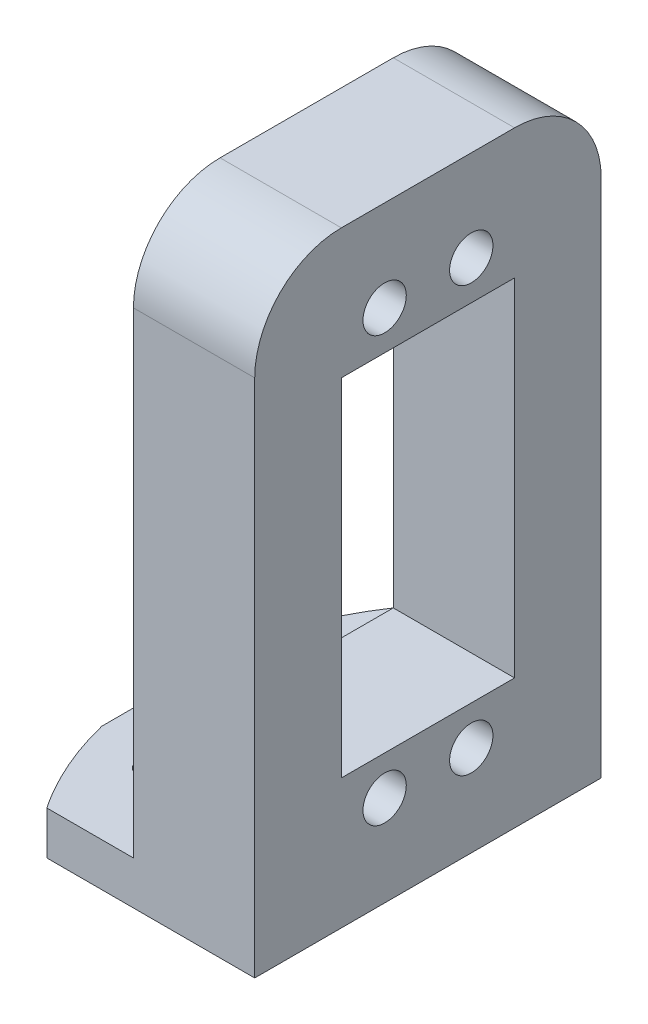
ISO-10303-21;
HEADER;
FILE_DESCRIPTION(('STEP AP214'),'2;1');
FILE_NAME('part.step','',(''),(''),'','','');
FILE_SCHEMA(('AUTOMOTIVE_DESIGN { 1 0 10303 214 1 1 1 1 }'));
ENDSEC;
DATA;
#1=APPLICATION_CONTEXT('core data for automotive mechanical design processes');
#2=APPLICATION_PROTOCOL_DEFINITION('international standard','automotive_design',2000,#1);
#3=PRODUCT_CONTEXT('',#1,'mechanical');
#4=PRODUCT('Part','Part','',(#3));
#5=PRODUCT_RELATED_PRODUCT_CATEGORY('part','',(#4));
#6=PRODUCT_DEFINITION_FORMATION('','',#4);
#7=PRODUCT_DEFINITION_CONTEXT('part definition',#1,'design');
#8=PRODUCT_DEFINITION('design','',#6,#7);
#9=PRODUCT_DEFINITION_SHAPE('','',#8);
#10=(LENGTH_UNIT() NAMED_UNIT(*) SI_UNIT(.MILLI.,.METRE.));
#11=(NAMED_UNIT(*) PLANE_ANGLE_UNIT() SI_UNIT($,.RADIAN.));
#12=(NAMED_UNIT(*) SI_UNIT($,.STERADIAN.) SOLID_ANGLE_UNIT());
#13=UNCERTAINTY_MEASURE_WITH_UNIT(LENGTH_MEASURE(1.E-05),#10,'distance_accuracy_value','');
#14=(GEOMETRIC_REPRESENTATION_CONTEXT(3) GLOBAL_UNCERTAINTY_ASSIGNED_CONTEXT((#13)) GLOBAL_UNIT_ASSIGNED_CONTEXT((#10,
#11,#12)) REPRESENTATION_CONTEXT('',''));
#15=CARTESIAN_POINT('',(0.,0.,0.));
#16=DIRECTION('',(0.,0.,1.));
#17=DIRECTION('',(1.,0.,0.));
#18=AXIS2_PLACEMENT_3D('',#15,#16,#17);
#19=CARTESIAN_POINT('',(0.,-24.5,5.));
#20=DIRECTION('',(1.,0.,0.));
#21=DIRECTION('',(0.,0.,-1.));
#22=AXIS2_PLACEMENT_3D('',#19,#20,#21);
#23=CYLINDRICAL_SURFACE('',#22,1.5);
#24=CARTESIAN_POINT('',(-5.,-24.5,5.));
#25=DIRECTION('',(-1.,0.,0.));
#26=DIRECTION('',(0.,0.,1.));
#27=AXIS2_PLACEMENT_3D('',#24,#25,#26);
#28=CIRCLE('',#27,1.5);
#29=CARTESIAN_POINT('',(-5.,-24.5,6.50000000000001));
#30=VERTEX_POINT('',#29);
#31=EDGE_CURVE('E179',#30,#30,#28,.T.);
#32=ORIENTED_EDGE('',*,*,#31,.T.);
#33=EDGE_LOOP('',(#32));
#34=FACE_BOUND('',#33,.T.);
#35=CARTESIAN_POINT('',(4.,-24.5,5.));
#36=DIRECTION('',(1.,0.,0.));
#37=DIRECTION('',(0.,0.,-1.));
#38=AXIS2_PLACEMENT_3D('',#35,#36,#37);
#39=CIRCLE('',#38,1.5);
#40=CARTESIAN_POINT('',(4.,-24.5,3.5));
#41=VERTEX_POINT('',#40);
#42=EDGE_CURVE('E44',#41,#41,#39,.F.);
#43=ORIENTED_EDGE('',*,*,#42,.F.);
#44=EDGE_LOOP('',(#43));
#45=FACE_BOUND('',#44,.T.);
#46=ADVANCED_FACE('F40',(#34,#45),#23,.F.);
#47=CARTESIAN_POINT('',(0.,24.5,-5.));
#48=DIRECTION('',(1.,0.,0.));
#49=DIRECTION('',(0.,0.,-1.));
#50=AXIS2_PLACEMENT_3D('',#47,#48,#49);
#51=CYLINDRICAL_SURFACE('',#50,1.5);
#52=CARTESIAN_POINT('',(-5.,24.5,-5.));
#53=DIRECTION('',(-1.,0.,0.));
#54=DIRECTION('',(0.,0.,1.));
#55=AXIS2_PLACEMENT_3D('',#52,#53,#54);
#56=CIRCLE('',#55,1.5);
#57=CARTESIAN_POINT('',(-5.,24.5,-3.49999999999999));
#58=VERTEX_POINT('',#57);
#59=EDGE_CURVE('E191',#58,#58,#56,.T.);
#60=ORIENTED_EDGE('',*,*,#59,.T.);
#61=EDGE_LOOP('',(#60));
#62=FACE_BOUND('',#61,.T.);
#63=CARTESIAN_POINT('',(4.,24.5,-5.));
#64=DIRECTION('',(1.,0.,0.));
#65=DIRECTION('',(0.,0.,-1.));
#66=AXIS2_PLACEMENT_3D('',#63,#64,#65);
#67=CIRCLE('',#66,1.5);
#68=CARTESIAN_POINT('',(4.,24.5,-6.5));
#69=VERTEX_POINT('',#68);
#70=EDGE_CURVE('E364',#69,#69,#67,.F.);
#71=ORIENTED_EDGE('',*,*,#70,.F.);
#72=EDGE_LOOP('',(#71));
#73=FACE_BOUND('',#72,.T.);
#74=ADVANCED_FACE('F376',(#62,#73),#51,.F.);
#75=CARTESIAN_POINT('',(0.,24.5,5.));
#76=DIRECTION('',(1.,0.,0.));
#77=DIRECTION('',(0.,0.,-1.));
#78=AXIS2_PLACEMENT_3D('',#75,#76,#77);
#79=CYLINDRICAL_SURFACE('',#78,1.5);
#80=CARTESIAN_POINT('',(-5.,24.5,5.));
#81=DIRECTION('',(-1.,0.,0.));
#82=DIRECTION('',(0.,0.,1.));
#83=AXIS2_PLACEMENT_3D('',#80,#81,#82);
#84=CIRCLE('',#83,1.5);
#85=CARTESIAN_POINT('',(-5.,24.5,6.50000000000001));
#86=VERTEX_POINT('',#85);
#87=EDGE_CURVE('E187',#86,#86,#84,.T.);
#88=ORIENTED_EDGE('',*,*,#87,.T.);
#89=EDGE_LOOP('',(#88));
#90=FACE_BOUND('',#89,.T.);
#91=CARTESIAN_POINT('',(4.,24.5,5.));
#92=DIRECTION('',(1.,0.,0.));
#93=DIRECTION('',(0.,0.,-1.));
#94=AXIS2_PLACEMENT_3D('',#91,#92,#93);
#95=CIRCLE('',#94,1.5);
#96=CARTESIAN_POINT('',(4.,24.5,3.5));
#97=VERTEX_POINT('',#96);
#98=EDGE_CURVE('E360',#97,#97,#95,.F.);
#99=ORIENTED_EDGE('',*,*,#98,.F.);
#100=EDGE_LOOP('',(#99));
#101=FACE_BOUND('',#100,.T.);
#102=ADVANCED_FACE('F383',(#90,#101),#79,.F.);
#103=CARTESIAN_POINT('',(0.,-24.5,-5.));
#104=DIRECTION('',(1.,0.,0.));
#105=DIRECTION('',(0.,0.,-1.));
#106=AXIS2_PLACEMENT_3D('',#103,#104,#105);
#107=CYLINDRICAL_SURFACE('',#106,1.5);
#108=CARTESIAN_POINT('',(-5.,-24.5,-5.));
#109=DIRECTION('',(-1.,0.,0.));
#110=DIRECTION('',(0.,0.,1.));
#111=AXIS2_PLACEMENT_3D('',#108,#109,#110);
#112=CIRCLE('',#111,1.5);
#113=CARTESIAN_POINT('',(-5.,-24.5,-3.49999999999999));
#114=VERTEX_POINT('',#113);
#115=EDGE_CURVE('E183',#114,#114,#112,.T.);
#116=ORIENTED_EDGE('',*,*,#115,.T.);
#117=EDGE_LOOP('',(#116));
#118=FACE_BOUND('',#117,.T.);
#119=CARTESIAN_POINT('',(4.,-24.5,-5.));
#120=DIRECTION('',(1.,0.,0.));
#121=DIRECTION('',(0.,0.,-1.));
#122=AXIS2_PLACEMENT_3D('',#119,#120,#121);
#123=CIRCLE('',#122,1.5);
#124=CARTESIAN_POINT('',(4.,-24.5,-6.5));
#125=VERTEX_POINT('',#124);
#126=EDGE_CURVE('E356',#125,#125,#123,.F.);
#127=ORIENTED_EDGE('',*,*,#126,.F.);
#128=EDGE_LOOP('',(#127));
#129=FACE_BOUND('',#128,.T.);
#130=ADVANCED_FACE('F467',(#118,#129),#107,.F.);
#131=CARTESIAN_POINT('',(9.,35.,-20.));
#132=DIRECTION('',(0.,0.,1.));
#133=DIRECTION('',(0.,-1.,0.));
#134=AXIS2_PLACEMENT_3D('',#131,#132,#133);
#135=PLANE('',#134);
#136=DIRECTION('',(0.,1.,0.));
#137=VECTOR('',#136,1.);
#138=CARTESIAN_POINT('',(-15.,-35.,-20.));
#139=LINE('',#138,#137);
#140=CARTESIAN_POINT('',(-15.,-35.,-20.));
#141=VERTEX_POINT('',#140);
#142=CARTESIAN_POINT('',(-15.,-30.,-20.));
#143=VERTEX_POINT('',#142);
#144=EDGE_CURVE('E219',#141,#143,#139,.T.);
#145=ORIENTED_EDGE('',*,*,#144,.T.);
#146=DIRECTION('',(1.,0.,0.));
#147=VECTOR('',#146,1.);
#148=CARTESIAN_POINT('',(-15.,-30.,-20.));
#149=LINE('',#148,#147);
#150=CARTESIAN_POINT('',(-5.,-30.,-20.));
#151=VERTEX_POINT('',#150);
#152=EDGE_CURVE('E300',#143,#151,#149,.T.);
#153=ORIENTED_EDGE('',*,*,#152,.T.);
#154=DIRECTION('',(0.,-1.,0.));
#155=VECTOR('',#154,1.);
#156=CARTESIAN_POINT('',(-5.,24.9999999999999,-20.));
#157=LINE('',#156,#155);
#158=CARTESIAN_POINT('',(-5.,24.9999999999999,-20.0000000000001));
#159=VERTEX_POINT('',#158);
#160=EDGE_CURVE('E195',#159,#151,#157,.T.);
#161=ORIENTED_EDGE('',*,*,#160,.F.);
#162=DIRECTION('',(1.,0.,0.));
#163=VECTOR('',#162,1.);
#164=CARTESIAN_POINT('',(-15.,25.,-20.));
#165=LINE('',#164,#163);
#166=CARTESIAN_POINT('',(9.,25.,-20.));
#167=VERTEX_POINT('',#166);
#168=EDGE_CURVE('E306',#159,#167,#165,.T.);
#169=ORIENTED_EDGE('',*,*,#168,.T.);
#170=DIRECTION('',(0.,1.,0.));
#171=VECTOR('',#170,1.);
#172=CARTESIAN_POINT('',(9.,35.,-20.));
#173=LINE('',#172,#171);
#174=CARTESIAN_POINT('',(9.,-35.,-20.));
#175=VERTEX_POINT('',#174);
#176=EDGE_CURVE('E334',#175,#167,#173,.T.);
#177=ORIENTED_EDGE('',*,*,#176,.F.);
#178=DIRECTION('',(-1.,0.,0.));
#179=VECTOR('',#178,1.);
#180=CARTESIAN_POINT('',(9.,-35.,-20.));
#181=LINE('',#180,#179);
#182=EDGE_CURVE('E50',#175,#141,#181,.T.);
#183=ORIENTED_EDGE('',*,*,#182,.T.);
#184=EDGE_LOOP('',(#145,#153,#161,#169,#177,#183));
#185=FACE_BOUND('',#184,.T.);
#186=ADVANCED_FACE('F42',(#185),#135,.F.);
#187=CARTESIAN_POINT('',(9.,35.,20.));
#188=DIRECTION('',(0.,0.,-1.));
#189=DIRECTION('',(0.,1.,0.));
#190=AXIS2_PLACEMENT_3D('',#187,#188,#189);
#191=PLANE('',#190);
#192=DIRECTION('',(0.,1.,0.));
#193=VECTOR('',#192,1.);
#194=CARTESIAN_POINT('',(-15.,-35.,20.));
#195=LINE('',#194,#193);
#196=CARTESIAN_POINT('',(-15.,-35.,20.));
#197=VERTEX_POINT('',#196);
#198=CARTESIAN_POINT('',(-15.,-30.,20.));
#199=VERTEX_POINT('',#198);
#200=EDGE_CURVE('E254',#197,#199,#195,.T.);
#201=ORIENTED_EDGE('',*,*,#200,.F.);
#202=DIRECTION('',(-1.,0.,0.));
#203=VECTOR('',#202,1.);
#204=CARTESIAN_POINT('',(9.,-35.,20.));
#205=LINE('',#204,#203);
#206=CARTESIAN_POINT('',(9.,-35.,20.));
#207=VERTEX_POINT('',#206);
#208=EDGE_CURVE('E11',#207,#197,#205,.T.);
#209=ORIENTED_EDGE('',*,*,#208,.F.);
#210=DIRECTION('',(0.,-1.,0.));
#211=VECTOR('',#210,1.);
#212=CARTESIAN_POINT('',(9.,35.,20.));
#213=LINE('',#212,#211);
#214=CARTESIAN_POINT('',(9.,25.,20.));
#215=VERTEX_POINT('',#214);
#216=EDGE_CURVE('E347',#215,#207,#213,.T.);
#217=ORIENTED_EDGE('',*,*,#216,.F.);
#218=DIRECTION('',(1.,0.,0.));
#219=VECTOR('',#218,1.);
#220=CARTESIAN_POINT('',(-15.,25.,20.));
#221=LINE('',#220,#219);
#222=CARTESIAN_POINT('',(-5.,25.,20.));
#223=VERTEX_POINT('',#222);
#224=EDGE_CURVE('E297',#223,#215,#221,.T.);
#225=ORIENTED_EDGE('',*,*,#224,.F.);
#226=DIRECTION('',(0.,1.,0.));
#227=VECTOR('',#226,1.);
#228=CARTESIAN_POINT('',(-5.,-27.,20.));
#229=LINE('',#228,#227);
#230=CARTESIAN_POINT('',(-5.,-30.,20.));
#231=VERTEX_POINT('',#230);
#232=EDGE_CURVE('E198',#231,#223,#229,.T.);
#233=ORIENTED_EDGE('',*,*,#232,.F.);
#234=DIRECTION('',(1.,0.,0.));
#235=VECTOR('',#234,1.);
#236=CARTESIAN_POINT('',(-15.,-30.,20.));
#237=LINE('',#236,#235);
#238=EDGE_CURVE('E315',#199,#231,#237,.T.);
#239=ORIENTED_EDGE('',*,*,#238,.F.);
#240=EDGE_LOOP('',(#201,#209,#217,#225,#233,#239));
#241=FACE_BOUND('',#240,.T.);
#242=ADVANCED_FACE('F411',(#241),#191,.F.);
#243=CARTESIAN_POINT('',(9.,-35.,20.));
#244=DIRECTION('',(0.,1.,0.));
#245=DIRECTION('',(0.,0.,1.));
#246=AXIS2_PLACEMENT_3D('',#243,#244,#245);
#247=PLANE('',#246);
#248=CARTESIAN_POINT('',(-13.,-35.,-10.));
#249=DIRECTION('',(0.,1.,0.));
#250=DIRECTION('',(0.,0.,1.));
#251=AXIS2_PLACEMENT_3D('',#248,#249,#250);
#252=CIRCLE('',#251,1.5);
#253=CARTESIAN_POINT('',(-13.,-35.,-8.50000000000001));
#254=VERTEX_POINT('',#253);
#255=EDGE_CURVE('E262',#254,#254,#252,.T.);
#256=ORIENTED_EDGE('',*,*,#255,.T.);
#257=EDGE_LOOP('',(#256));
#258=FACE_BOUND('',#257,.T.);
#259=CARTESIAN_POINT('',(-13.,-35.,9.99999999999999));
#260=DIRECTION('',(0.,1.,0.));
#261=DIRECTION('',(0.,0.,1.));
#262=AXIS2_PLACEMENT_3D('',#259,#260,#261);
#263=CIRCLE('',#262,1.5);
#264=CARTESIAN_POINT('',(-13.,-35.,11.5));
#265=VERTEX_POINT('',#264);
#266=EDGE_CURVE('E271',#265,#265,#263,.T.);
#267=ORIENTED_EDGE('',*,*,#266,.T.);
#268=EDGE_LOOP('',(#267));
#269=FACE_BOUND('',#268,.T.);
#270=CARTESIAN_POINT('',(-15.,-35.,-20.));
#271=CARTESIAN_POINT('',(-23.0603486349909,-35.,-8.00303116626541));
#272=CARTESIAN_POINT('',(-23.0603486349909,-35.,7.99696883373459));
#273=CARTESIAN_POINT('',(-15.,-35.,20.));
#274=B_SPLINE_CURVE_WITH_KNOTS('',3,(#270,#271,#272,#273),.UNSPECIFIED.,.F.,.F.,(4,4),(0.,1.),.UNSPECIFIED.);
#275=CARTESIAN_POINT('',(-20.,-35.,-8.66219364434589));
#276=VERTEX_POINT('',#275);
#277=EDGE_CURVE('E66',#141,#276,#274,.T.);
#278=ORIENTED_EDGE('',*,*,#277,.F.);
#279=ORIENTED_EDGE('',*,*,#182,.F.);
#280=DIRECTION('',(0.,0.,-1.));
#281=VECTOR('',#280,1.);
#282=CARTESIAN_POINT('',(9.,-35.,20.));
#283=LINE('',#282,#281);
#284=EDGE_CURVE('E350',#207,#175,#283,.T.);
#285=ORIENTED_EDGE('',*,*,#284,.F.);
#286=ORIENTED_EDGE('',*,*,#208,.T.);
#287=CARTESIAN_POINT('',(-15.,-35.,-20.));
#288=CARTESIAN_POINT('',(-23.0603486349909,-35.,-8.00303116626541));
#289=CARTESIAN_POINT('',(-23.0603486349909,-35.,7.99696883373459));
#290=CARTESIAN_POINT('',(-15.,-35.,20.));
#291=B_SPLINE_CURVE_WITH_KNOTS('',3,(#287,#288,#289,#290),.UNSPECIFIED.,.F.,.F.,(4,4),(0.,1.),.UNSPECIFIED.);
#292=CARTESIAN_POINT('',(-20.,-35.,8.65843305481963));
#293=VERTEX_POINT('',#292);
#294=EDGE_CURVE('E239',#293,#197,#291,.T.);
#295=ORIENTED_EDGE('',*,*,#294,.F.);
#296=DIRECTION('',(0.,0.,1.));
#297=VECTOR('',#296,1.);
#298=CARTESIAN_POINT('',(-20.,-35.,-20.));
#299=LINE('',#298,#297);
#300=EDGE_CURVE('E266',#276,#293,#299,.T.);
#301=ORIENTED_EDGE('',*,*,#300,.F.);
#302=EDGE_LOOP('',(#278,#279,#285,#286,#295,#301));
#303=FACE_BOUND('',#302,.T.);
#304=ADVANCED_FACE('F407',(#258,#269,#303),#247,.F.);
#305=CARTESIAN_POINT('',(-15.,-30.,-20.));
#306=DIRECTION('',(0.,-1.,0.));
#307=DIRECTION('',(0.,0.,-1.));
#308=AXIS2_PLACEMENT_3D('',#305,#306,#307);
#309=PLANE('',#308);
#310=CARTESIAN_POINT('',(-13.,-30.,-10.));
#311=DIRECTION('',(0.,1.,0.));
#312=DIRECTION('',(0.,0.,1.));
#313=AXIS2_PLACEMENT_3D('',#310,#311,#312);
#314=CIRCLE('',#313,1.5);
#315=CARTESIAN_POINT('',(-13.,-30.,-8.50000000000001));
#316=VERTEX_POINT('',#315);
#317=EDGE_CURVE('E267',#316,#316,#314,.T.);
#318=ORIENTED_EDGE('',*,*,#317,.F.);
#319=EDGE_LOOP('',(#318));
#320=FACE_BOUND('',#319,.T.);
#321=CARTESIAN_POINT('',(-13.,-30.,9.99999999999999));
#322=DIRECTION('',(0.,1.,0.));
#323=DIRECTION('',(0.,0.,1.));
#324=AXIS2_PLACEMENT_3D('',#321,#322,#323);
#325=CIRCLE('',#324,1.5);
#326=CARTESIAN_POINT('',(-13.,-30.,11.5));
#327=VERTEX_POINT('',#326);
#328=EDGE_CURVE('E275',#327,#327,#325,.T.);
#329=ORIENTED_EDGE('',*,*,#328,.F.);
#330=EDGE_LOOP('',(#329));
#331=FACE_BOUND('',#330,.T.);
#332=CARTESIAN_POINT('',(-15.,-30.,-20.));
#333=CARTESIAN_POINT('',(-23.0603486349909,-30.,-8.00303116626541));
#334=CARTESIAN_POINT('',(-23.0603486349909,-30.,7.99696883373459));
#335=CARTESIAN_POINT('',(-15.,-30.,20.));
#336=B_SPLINE_CURVE_WITH_KNOTS('',3,(#332,#333,#334,#335),.UNSPECIFIED.,.F.,.F.,(4,4),(0.,1.),.UNSPECIFIED.);
#337=CARTESIAN_POINT('',(-20.,-30.,-8.66219364434589));
#338=VERTEX_POINT('',#337);
#339=EDGE_CURVE('E220',#143,#338,#336,.T.);
#340=ORIENTED_EDGE('',*,*,#339,.T.);
#341=DIRECTION('',(0.,0.,-1.));
#342=VECTOR('',#341,1.);
#343=CARTESIAN_POINT('',(-20.,-30.,-20.));
#344=LINE('',#343,#342);
#345=CARTESIAN_POINT('',(-20.,-30.,8.65843305481963));
#346=VERTEX_POINT('',#345);
#347=EDGE_CURVE('E283',#346,#338,#344,.T.);
#348=ORIENTED_EDGE('',*,*,#347,.F.);
#349=CARTESIAN_POINT('',(-15.,-30.,-20.));
#350=CARTESIAN_POINT('',(-23.0603486349909,-30.,-8.00303116626541));
#351=CARTESIAN_POINT('',(-23.0603486349909,-30.,7.99696883373459));
#352=CARTESIAN_POINT('',(-15.,-30.,20.));
#353=B_SPLINE_CURVE_WITH_KNOTS('',3,(#349,#350,#351,#352),.UNSPECIFIED.,.F.,.F.,(4,4),(0.,1.),.UNSPECIFIED.);
#354=EDGE_CURVE('E58',#346,#199,#353,.T.);
#355=ORIENTED_EDGE('',*,*,#354,.T.);
#356=ORIENTED_EDGE('',*,*,#238,.T.);
#357=DIRECTION('',(0.,0.,-1.));
#358=VECTOR('',#357,1.);
#359=CARTESIAN_POINT('',(-5.,-30.,20.));
#360=LINE('',#359,#358);
#361=EDGE_CURVE('E287',#231,#151,#360,.T.);
#362=ORIENTED_EDGE('',*,*,#361,.T.);
#363=ORIENTED_EDGE('',*,*,#152,.F.);
#364=EDGE_LOOP('',(#340,#348,#355,#356,#362,#363));
#365=FACE_BOUND('',#364,.T.);
#366=ADVANCED_FACE('F410',(#320,#331,#365),#309,.F.);
#367=CARTESIAN_POINT('',(-20.,0.,0.));
#368=DIRECTION('',(-1.,0.,0.));
#369=DIRECTION('',(0.,0.,1.));
#370=AXIS2_PLACEMENT_3D('',#367,#368,#369);
#371=PLANE('',#370);
#372=ORIENTED_EDGE('',*,*,#347,.T.);
#373=DIRECTION('',(0.,1.,0.));
#374=VECTOR('',#373,1.);
#375=CARTESIAN_POINT('',(-20.,-35.,-8.66219364434589));
#376=LINE('',#375,#374);
#377=EDGE_CURVE('E279',#276,#338,#376,.T.);
#378=ORIENTED_EDGE('',*,*,#377,.F.);
#379=ORIENTED_EDGE('',*,*,#300,.T.);
#380=DIRECTION('',(0.,1.,0.));
#381=VECTOR('',#380,1.);
#382=CARTESIAN_POINT('',(-20.,-35.,8.65843305481963));
#383=LINE('',#382,#381);
#384=EDGE_CURVE('E246',#293,#346,#383,.T.);
#385=ORIENTED_EDGE('',*,*,#384,.T.);
#386=EDGE_LOOP('',(#372,#378,#379,#385));
#387=FACE_BOUND('',#386,.T.);
#388=ADVANCED_FACE('F416',(#387),#371,.T.);
#389=CARTESIAN_POINT('',(9.,35.,20.));
#390=DIRECTION('',(0.,-1.,0.));
#391=DIRECTION('',(0.,0.,-1.));
#392=AXIS2_PLACEMENT_3D('',#389,#390,#391);
#393=PLANE('',#392);
#394=DIRECTION('',(1.,0.,0.));
#395=VECTOR('',#394,1.);
#396=CARTESIAN_POINT('',(-15.,35.,10.));
#397=LINE('',#396,#395);
#398=CARTESIAN_POINT('',(-5.,35.,10.));
#399=VERTEX_POINT('',#398);
#400=CARTESIAN_POINT('',(9.,35.,10.));
#401=VERTEX_POINT('',#400);
#402=EDGE_CURVE('E295',#399,#401,#397,.T.);
#403=ORIENTED_EDGE('',*,*,#402,.T.);
#404=DIRECTION('',(0.,0.,1.));
#405=VECTOR('',#404,1.);
#406=CARTESIAN_POINT('',(9.,35.,20.));
#407=LINE('',#406,#405);
#408=CARTESIAN_POINT('',(9.,35.,-10.));
#409=VERTEX_POINT('',#408);
#410=EDGE_CURVE('E343',#409,#401,#407,.T.);
#411=ORIENTED_EDGE('',*,*,#410,.F.);
#412=DIRECTION('',(1.,0.,0.));
#413=VECTOR('',#412,1.);
#414=CARTESIAN_POINT('',(-15.,35.,-10.));
#415=LINE('',#414,#413);
#416=CARTESIAN_POINT('',(-5.,35.,-10.));
#417=VERTEX_POINT('',#416);
#418=EDGE_CURVE('E296',#417,#409,#415,.T.);
#419=ORIENTED_EDGE('',*,*,#418,.F.);
#420=DIRECTION('',(0.,0.,-1.));
#421=VECTOR('',#420,1.);
#422=CARTESIAN_POINT('',(-5.,35.,-10.));
#423=LINE('',#422,#421);
#424=EDGE_CURVE('E206',#399,#417,#423,.T.);
#425=ORIENTED_EDGE('',*,*,#424,.F.);
#426=EDGE_LOOP('',(#403,#411,#419,#425));
#427=FACE_BOUND('',#426,.T.);
#428=ADVANCED_FACE('F405',(#427),#393,.F.);
#429=CARTESIAN_POINT('',(9.,0.,0.));
#430=DIRECTION('',(1.,0.,0.));
#431=DIRECTION('',(0.,0.,-1.));
#432=AXIS2_PLACEMENT_3D('',#429,#430,#431);
#433=PLANE('',#432);
#434=CARTESIAN_POINT('',(9.,24.5,-5.));
#435=DIRECTION('',(1.,0.,0.));
#436=DIRECTION('',(0.,0.,-1.));
#437=AXIS2_PLACEMENT_3D('',#434,#435,#436);
#438=CIRCLE('',#437,2.5);
#439=CARTESIAN_POINT('',(9.,24.5,-7.5));
#440=VERTEX_POINT('',#439);
#441=EDGE_CURVE('E530',#440,#440,#438,.T.);
#442=ORIENTED_EDGE('',*,*,#441,.F.);
#443=EDGE_LOOP('',(#442));
#444=FACE_BOUND('',#443,.T.);
#445=CARTESIAN_POINT('',(9.,-24.5,5.));
#446=DIRECTION('',(1.,0.,0.));
#447=DIRECTION('',(0.,0.,-1.));
#448=AXIS2_PLACEMENT_3D('',#445,#446,#447);
#449=CIRCLE('',#448,2.5);
#450=CARTESIAN_POINT('',(9.,-24.5,2.5));
#451=VERTEX_POINT('',#450);
#452=EDGE_CURVE('E533',#451,#451,#449,.T.);
#453=ORIENTED_EDGE('',*,*,#452,.F.);
#454=EDGE_LOOP('',(#453));
#455=FACE_BOUND('',#454,.T.);
#456=CARTESIAN_POINT('',(9.,-24.5,-5.));
#457=DIRECTION('',(1.,0.,0.));
#458=DIRECTION('',(0.,0.,-1.));
#459=AXIS2_PLACEMENT_3D('',#456,#457,#458);
#460=CIRCLE('',#459,2.5);
#461=CARTESIAN_POINT('',(9.,-24.5,-7.5));
#462=VERTEX_POINT('',#461);
#463=EDGE_CURVE('E545',#462,#462,#460,.T.);
#464=ORIENTED_EDGE('',*,*,#463,.F.);
#465=EDGE_LOOP('',(#464));
#466=FACE_BOUND('',#465,.T.);
#467=CARTESIAN_POINT('',(9.,24.5,5.));
#468=DIRECTION('',(1.,0.,0.));
#469=DIRECTION('',(0.,0.,-1.));
#470=AXIS2_PLACEMENT_3D('',#467,#468,#469);
#471=CIRCLE('',#470,2.5);
#472=CARTESIAN_POINT('',(9.,24.5,2.5));
#473=VERTEX_POINT('',#472);
#474=EDGE_CURVE('E522',#473,#473,#471,.T.);
#475=ORIENTED_EDGE('',*,*,#474,.F.);
#476=EDGE_LOOP('',(#475));
#477=FACE_BOUND('',#476,.T.);
#478=CARTESIAN_POINT('',(9.,25.,10.));
#479=DIRECTION('',(-1.,0.,0.));
#480=DIRECTION('',(0.,0.,-1.));
#481=AXIS2_PLACEMENT_3D('',#478,#479,#480);
#482=CIRCLE('',#481,10.);
#483=EDGE_CURVE('E292',#215,#401,#482,.T.);
#484=ORIENTED_EDGE('',*,*,#483,.F.);
#485=ORIENTED_EDGE('',*,*,#216,.T.);
#486=ORIENTED_EDGE('',*,*,#284,.T.);
#487=ORIENTED_EDGE('',*,*,#176,.T.);
#488=CARTESIAN_POINT('',(9.,25.,-10.));
#489=DIRECTION('',(-1.,0.,0.));
#490=DIRECTION('',(0.,0.,-1.));
#491=AXIS2_PLACEMENT_3D('',#488,#489,#490);
#492=CIRCLE('',#491,10.);
#493=EDGE_CURVE('E291',#409,#167,#492,.T.);
#494=ORIENTED_EDGE('',*,*,#493,.F.);
#495=ORIENTED_EDGE('',*,*,#410,.T.);
#496=EDGE_LOOP('',(#484,#485,#486,#487,#494,#495));
#497=FACE_BOUND('',#496,.T.);
#498=DIRECTION('',(0.,1.,0.));
#499=VECTOR('',#498,1.);
#500=CARTESIAN_POINT('',(9.,20.,10.));
#501=LINE('',#500,#499);
#502=CARTESIAN_POINT('',(9.,-20.,10.));
#503=VERTEX_POINT('',#502);
#504=CARTESIAN_POINT('',(9.,20.,10.));
#505=VERTEX_POINT('',#504);
#506=EDGE_CURVE('E319',#503,#505,#501,.T.);
#507=ORIENTED_EDGE('',*,*,#506,.T.);
#508=DIRECTION('',(0.,0.,-1.));
#509=VECTOR('',#508,1.);
#510=CARTESIAN_POINT('',(9.,20.,-10.));
#511=LINE('',#510,#509);
#512=CARTESIAN_POINT('',(9.,20.,-10.));
#513=VERTEX_POINT('',#512);
#514=EDGE_CURVE('E323',#505,#513,#511,.T.);
#515=ORIENTED_EDGE('',*,*,#514,.T.);
#516=DIRECTION('',(0.,-1.,0.));
#517=VECTOR('',#516,1.);
#518=CARTESIAN_POINT('',(9.,20.,-10.));
#519=LINE('',#518,#517);
#520=CARTESIAN_POINT('',(9.,-20.,-10.));
#521=VERTEX_POINT('',#520);
#522=EDGE_CURVE('E327',#513,#521,#519,.T.);
#523=ORIENTED_EDGE('',*,*,#522,.T.);
#524=DIRECTION('',(0.,0.,1.));
#525=VECTOR('',#524,1.);
#526=CARTESIAN_POINT('',(9.,-20.,-10.));
#527=LINE('',#526,#525);
#528=EDGE_CURVE('E151',#521,#503,#527,.T.);
#529=ORIENTED_EDGE('',*,*,#528,.T.);
#530=EDGE_LOOP('',(#507,#515,#523,#529));
#531=FACE_BOUND('',#530,.T.);
#532=ADVANCED_FACE('F401',(#444,#455,#466,#477,#497,#531),#433,.T.);
#533=CARTESIAN_POINT('',(9.,20.,10.));
#534=DIRECTION('',(0.,0.,1.));
#535=DIRECTION('',(0.,-1.,0.));
#536=AXIS2_PLACEMENT_3D('',#533,#534,#535);
#537=PLANE('',#536);
#538=DIRECTION('',(-1.,0.,0.));
#539=VECTOR('',#538,1.);
#540=CARTESIAN_POINT('',(9.,-20.,10.));
#541=LINE('',#540,#539);
#542=CARTESIAN_POINT('',(-5.,-20.,10.));
#543=VERTEX_POINT('',#542);
#544=EDGE_CURVE('E155',#503,#543,#541,.T.);
#545=ORIENTED_EDGE('',*,*,#544,.T.);
#546=DIRECTION('',(0.,1.,0.));
#547=VECTOR('',#546,1.);
#548=CARTESIAN_POINT('',(-5.,20.,10.));
#549=LINE('',#548,#547);
#550=CARTESIAN_POINT('',(-5.,20.,10.));
#551=VERTEX_POINT('',#550);
#552=EDGE_CURVE('E169',#543,#551,#549,.T.);
#553=ORIENTED_EDGE('',*,*,#552,.T.);
#554=DIRECTION('',(-1.,0.,0.));
#555=VECTOR('',#554,1.);
#556=CARTESIAN_POINT('',(9.,20.,10.));
#557=LINE('',#556,#555);
#558=EDGE_CURVE('E332',#505,#551,#557,.T.);
#559=ORIENTED_EDGE('',*,*,#558,.F.);
#560=ORIENTED_EDGE('',*,*,#506,.F.);
#561=EDGE_LOOP('',(#545,#553,#559,#560));
#562=FACE_BOUND('',#561,.T.);
#563=ADVANCED_FACE('F391',(#562),#537,.F.);
#564=CARTESIAN_POINT('',(9.,-20.,-10.));
#565=DIRECTION('',(0.,-1.,0.));
#566=DIRECTION('',(0.,0.,-1.));
#567=AXIS2_PLACEMENT_3D('',#564,#565,#566);
#568=PLANE('',#567);
#569=DIRECTION('',(-1.,0.,0.));
#570=VECTOR('',#569,1.);
#571=CARTESIAN_POINT('',(9.,-20.,-10.));
#572=LINE('',#571,#570);
#573=CARTESIAN_POINT('',(-5.,-20.,-10.));
#574=VERTEX_POINT('',#573);
#575=EDGE_CURVE('E144',#521,#574,#572,.T.);
#576=ORIENTED_EDGE('',*,*,#575,.T.);
#577=DIRECTION('',(0.,0.,1.));
#578=VECTOR('',#577,1.);
#579=CARTESIAN_POINT('',(-5.,-20.,-10.));
#580=LINE('',#579,#578);
#581=EDGE_CURVE('E148',#574,#543,#580,.T.);
#582=ORIENTED_EDGE('',*,*,#581,.T.);
#583=ORIENTED_EDGE('',*,*,#544,.F.);
#584=ORIENTED_EDGE('',*,*,#528,.F.);
#585=EDGE_LOOP('',(#576,#582,#583,#584));
#586=FACE_BOUND('',#585,.T.);
#587=ADVANCED_FACE('F146',(#586),#568,.F.);
#588=CARTESIAN_POINT('',(9.,20.,-10.));
#589=DIRECTION('',(0.,0.,-1.));
#590=DIRECTION('',(0.,1.,0.));
#591=AXIS2_PLACEMENT_3D('',#588,#589,#590);
#592=PLANE('',#591);
#593=DIRECTION('',(-1.,0.,0.));
#594=VECTOR('',#593,1.);
#595=CARTESIAN_POINT('',(9.,20.,-10.));
#596=LINE('',#595,#594);
#597=CARTESIAN_POINT('',(-5.,20.,-10.));
#598=VERTEX_POINT('',#597);
#599=EDGE_CURVE('E156',#513,#598,#596,.T.);
#600=ORIENTED_EDGE('',*,*,#599,.T.);
#601=DIRECTION('',(0.,-1.,0.));
#602=VECTOR('',#601,1.);
#603=CARTESIAN_POINT('',(-5.,20.,-10.));
#604=LINE('',#603,#602);
#605=EDGE_CURVE('E159',#598,#574,#604,.T.);
#606=ORIENTED_EDGE('',*,*,#605,.T.);
#607=ORIENTED_EDGE('',*,*,#575,.F.);
#608=ORIENTED_EDGE('',*,*,#522,.F.);
#609=EDGE_LOOP('',(#600,#606,#607,#608));
#610=FACE_BOUND('',#609,.T.);
#611=ADVANCED_FACE('F160',(#610),#592,.F.);
#612=CARTESIAN_POINT('',(9.,20.,-10.));
#613=DIRECTION('',(0.,1.,0.));
#614=DIRECTION('',(0.,0.,1.));
#615=AXIS2_PLACEMENT_3D('',#612,#613,#614);
#616=PLANE('',#615);
#617=ORIENTED_EDGE('',*,*,#558,.T.);
#618=DIRECTION('',(0.,0.,-1.));
#619=VECTOR('',#618,1.);
#620=CARTESIAN_POINT('',(-5.,20.,-10.));
#621=LINE('',#620,#619);
#622=EDGE_CURVE('E173',#551,#598,#621,.T.);
#623=ORIENTED_EDGE('',*,*,#622,.T.);
#624=ORIENTED_EDGE('',*,*,#599,.F.);
#625=ORIENTED_EDGE('',*,*,#514,.F.);
#626=EDGE_LOOP('',(#617,#623,#624,#625));
#627=FACE_BOUND('',#626,.T.);
#628=ADVANCED_FACE('F394',(#627),#616,.F.);
#629=CARTESIAN_POINT('',(-15.,25.,-10.));
#630=DIRECTION('',(1.,0.,0.));
#631=DIRECTION('',(0.,0.,-1.));
#632=AXIS2_PLACEMENT_3D('',#629,#630,#631);
#633=CYLINDRICAL_SURFACE('',#632,10.);
#634=ORIENTED_EDGE('',*,*,#418,.T.);
#635=ORIENTED_EDGE('',*,*,#493,.T.);
#636=ORIENTED_EDGE('',*,*,#168,.F.);
#637=CARTESIAN_POINT('',(-5.,24.9999999999999,-10.));
#638=DIRECTION('',(-1.,0.,0.));
#639=DIRECTION('',(0.,0.,1.));
#640=AXIS2_PLACEMENT_3D('',#637,#638,#639);
#641=CIRCLE('',#640,10.);
#642=EDGE_CURVE('E210',#417,#159,#641,.T.);
#643=ORIENTED_EDGE('',*,*,#642,.F.);
#644=EDGE_LOOP('',(#634,#635,#636,#643));
#645=FACE_BOUND('',#644,.T.);
#646=ADVANCED_FACE('F397',(#645),#633,.T.);
#647=CARTESIAN_POINT('',(-15.,25.,10.));
#648=DIRECTION('',(1.,0.,0.));
#649=DIRECTION('',(0.,0.,-1.));
#650=AXIS2_PLACEMENT_3D('',#647,#648,#649);
#651=CYLINDRICAL_SURFACE('',#650,10.);
#652=ORIENTED_EDGE('',*,*,#224,.T.);
#653=ORIENTED_EDGE('',*,*,#483,.T.);
#654=ORIENTED_EDGE('',*,*,#402,.F.);
#655=CARTESIAN_POINT('',(-5.,25.,10.));
#656=DIRECTION('',(-1.,0.,0.));
#657=DIRECTION('',(0.,0.,1.));
#658=AXIS2_PLACEMENT_3D('',#655,#656,#657);
#659=CIRCLE('',#658,10.);
#660=EDGE_CURVE('E202',#223,#399,#659,.T.);
#661=ORIENTED_EDGE('',*,*,#660,.F.);
#662=EDGE_LOOP('',(#652,#653,#654,#661));
#663=FACE_BOUND('',#662,.T.);
#664=ADVANCED_FACE('F442',(#663),#651,.T.);
#665=CARTESIAN_POINT('',(-13.,-35.,9.99999999999999));
#666=DIRECTION('',(0.,1.,0.));
#667=DIRECTION('',(0.,0.,1.));
#668=AXIS2_PLACEMENT_3D('',#665,#666,#667);
#669=CYLINDRICAL_SURFACE('',#668,1.5);
#670=ORIENTED_EDGE('',*,*,#266,.F.);
#671=EDGE_LOOP('',(#670));
#672=FACE_BOUND('',#671,.T.);
#673=ORIENTED_EDGE('',*,*,#328,.T.);
#674=EDGE_LOOP('',(#673));
#675=FACE_BOUND('',#674,.T.);
#676=ADVANCED_FACE('F660',(#672,#675),#669,.F.);
#677=CARTESIAN_POINT('',(-13.,-35.,-10.));
#678=DIRECTION('',(0.,1.,0.));
#679=DIRECTION('',(0.,0.,1.));
#680=AXIS2_PLACEMENT_3D('',#677,#678,#679);
#681=CYLINDRICAL_SURFACE('',#680,1.5);
#682=ORIENTED_EDGE('',*,*,#255,.F.);
#683=EDGE_LOOP('',(#682));
#684=FACE_BOUND('',#683,.T.);
#685=ORIENTED_EDGE('',*,*,#317,.T.);
#686=EDGE_LOOP('',(#685));
#687=FACE_BOUND('',#686,.T.);
#688=ADVANCED_FACE('F237',(#684,#687),#681,.F.);
#689=DIRECTION('',(0.,1.,0.));
#690=VECTOR('',#689,1.);
#691=SURFACE_OF_LINEAR_EXTRUSION('',#291,#690);
#692=ORIENTED_EDGE('',*,*,#354,.F.);
#693=ORIENTED_EDGE('',*,*,#384,.F.);
#694=ORIENTED_EDGE('',*,*,#294,.T.);
#695=ORIENTED_EDGE('',*,*,#200,.T.);
#696=EDGE_LOOP('',(#692,#693,#694,#695));
#697=FACE_BOUND('',#696,.T.);
#698=ADVANCED_FACE('F232',(#697),#691,.T.);
#699=DIRECTION('',(0.,1.,0.));
#700=VECTOR('',#699,1.);
#701=SURFACE_OF_LINEAR_EXTRUSION('',#274,#700);
#702=ORIENTED_EDGE('',*,*,#339,.F.);
#703=ORIENTED_EDGE('',*,*,#144,.F.);
#704=ORIENTED_EDGE('',*,*,#277,.T.);
#705=ORIENTED_EDGE('',*,*,#377,.T.);
#706=EDGE_LOOP('',(#702,#703,#704,#705));
#707=FACE_BOUND('',#706,.T.);
#708=ADVANCED_FACE('F228',(#707),#701,.T.);
#709=CARTESIAN_POINT('',(-5.,25.,10.));
#710=DIRECTION('',(-1.,0.,0.));
#711=DIRECTION('',(0.,0.,1.));
#712=AXIS2_PLACEMENT_3D('',#709,#710,#711);
#713=PLANE('',#712);
#714=ORIENTED_EDGE('',*,*,#115,.F.);
#715=EDGE_LOOP('',(#714));
#716=FACE_BOUND('',#715,.T.);
#717=ORIENTED_EDGE('',*,*,#59,.F.);
#718=EDGE_LOOP('',(#717));
#719=FACE_BOUND('',#718,.T.);
#720=ORIENTED_EDGE('',*,*,#160,.T.);
#721=ORIENTED_EDGE('',*,*,#361,.F.);
#722=ORIENTED_EDGE('',*,*,#232,.T.);
#723=ORIENTED_EDGE('',*,*,#660,.T.);
#724=ORIENTED_EDGE('',*,*,#424,.T.);
#725=ORIENTED_EDGE('',*,*,#642,.T.);
#726=EDGE_LOOP('',(#720,#721,#722,#723,#724,#725));
#727=FACE_BOUND('',#726,.T.);
#728=ORIENTED_EDGE('',*,*,#87,.F.);
#729=EDGE_LOOP('',(#728));
#730=FACE_BOUND('',#729,.T.);
#731=ORIENTED_EDGE('',*,*,#31,.F.);
#732=EDGE_LOOP('',(#731));
#733=FACE_BOUND('',#732,.T.);
#734=ORIENTED_EDGE('',*,*,#581,.F.);
#735=ORIENTED_EDGE('',*,*,#605,.F.);
#736=ORIENTED_EDGE('',*,*,#622,.F.);
#737=ORIENTED_EDGE('',*,*,#552,.F.);
#738=EDGE_LOOP('',(#734,#735,#736,#737));
#739=FACE_BOUND('',#738,.T.);
#740=ADVANCED_FACE('F167',(#716,#719,#727,#730,#733,#739),#713,.T.);
#741=CARTESIAN_POINT('',(4.,-24.5,-5.));
#742=DIRECTION('',(1.,0.,0.));
#743=DIRECTION('',(0.,0.,-1.));
#744=AXIS2_PLACEMENT_3D('',#741,#742,#743);
#745=PLANE('',#744);
#746=CARTESIAN_POINT('',(4.,-24.5,-5.));
#747=DIRECTION('',(1.,0.,0.));
#748=DIRECTION('',(0.,0.,-1.));
#749=AXIS2_PLACEMENT_3D('',#746,#747,#748);
#750=CIRCLE('',#749,2.5);
#751=CARTESIAN_POINT('',(4.,-24.5,-7.5));
#752=VERTEX_POINT('',#751);
#753=EDGE_CURVE('E538',#752,#752,#750,.T.);
#754=ORIENTED_EDGE('',*,*,#753,.T.);
#755=EDGE_LOOP('',(#754));
#756=FACE_BOUND('',#755,.T.);
#757=ORIENTED_EDGE('',*,*,#126,.T.);
#758=EDGE_LOOP('',(#757));
#759=FACE_BOUND('',#758,.T.);
#760=ADVANCED_FACE('F479',(#756,#759),#745,.T.);
#761=CARTESIAN_POINT('',(4.,-24.5,-5.));
#762=DIRECTION('',(1.,0.,0.));
#763=DIRECTION('',(0.,0.,-1.));
#764=AXIS2_PLACEMENT_3D('',#761,#762,#763);
#765=CYLINDRICAL_SURFACE('',#764,2.5);
#766=ORIENTED_EDGE('',*,*,#753,.F.);
#767=EDGE_LOOP('',(#766));
#768=FACE_BOUND('',#767,.T.);
#769=ORIENTED_EDGE('',*,*,#463,.T.);
#770=EDGE_LOOP('',(#769));
#771=FACE_BOUND('',#770,.T.);
#772=ADVANCED_FACE('F481',(#768,#771),#765,.F.);
#773=CARTESIAN_POINT('',(4.,24.5,5.));
#774=DIRECTION('',(1.,0.,0.));
#775=DIRECTION('',(0.,0.,-1.));
#776=AXIS2_PLACEMENT_3D('',#773,#774,#775);
#777=PLANE('',#776);
#778=CARTESIAN_POINT('',(4.,24.5,5.));
#779=DIRECTION('',(1.,0.,0.));
#780=DIRECTION('',(0.,0.,-1.));
#781=AXIS2_PLACEMENT_3D('',#778,#779,#780);
#782=CIRCLE('',#781,2.5);
#783=CARTESIAN_POINT('',(4.,24.5,2.5));
#784=VERTEX_POINT('',#783);
#785=EDGE_CURVE('E361',#784,#784,#782,.T.);
#786=ORIENTED_EDGE('',*,*,#785,.T.);
#787=EDGE_LOOP('',(#786));
#788=FACE_BOUND('',#787,.T.);
#789=ORIENTED_EDGE('',*,*,#98,.T.);
#790=EDGE_LOOP('',(#789));
#791=FACE_BOUND('',#790,.T.);
#792=ADVANCED_FACE('F488',(#788,#791),#777,.T.);
#793=CARTESIAN_POINT('',(4.,24.5,5.));
#794=DIRECTION('',(1.,0.,0.));
#795=DIRECTION('',(0.,0.,-1.));
#796=AXIS2_PLACEMENT_3D('',#793,#794,#795);
#797=CYLINDRICAL_SURFACE('',#796,2.5);
#798=ORIENTED_EDGE('',*,*,#785,.F.);
#799=EDGE_LOOP('',(#798));
#800=FACE_BOUND('',#799,.T.);
#801=ORIENTED_EDGE('',*,*,#474,.T.);
#802=EDGE_LOOP('',(#801));
#803=FACE_BOUND('',#802,.T.);
#804=ADVANCED_FACE('F499',(#800,#803),#797,.F.);
#805=CARTESIAN_POINT('',(4.,24.5,-5.));
#806=DIRECTION('',(1.,0.,0.));
#807=DIRECTION('',(0.,0.,-1.));
#808=AXIS2_PLACEMENT_3D('',#805,#806,#807);
#809=PLANE('',#808);
#810=CARTESIAN_POINT('',(4.,24.5,-5.));
#811=DIRECTION('',(1.,0.,0.));
#812=DIRECTION('',(0.,0.,-1.));
#813=AXIS2_PLACEMENT_3D('',#810,#811,#812);
#814=CIRCLE('',#813,2.5);
#815=CARTESIAN_POINT('',(4.,24.5,-7.5));
#816=VERTEX_POINT('',#815);
#817=EDGE_CURVE('E525',#816,#816,#814,.T.);
#818=ORIENTED_EDGE('',*,*,#817,.T.);
#819=EDGE_LOOP('',(#818));
#820=FACE_BOUND('',#819,.T.);
#821=ORIENTED_EDGE('',*,*,#70,.T.);
#822=EDGE_LOOP('',(#821));
#823=FACE_BOUND('',#822,.T.);
#824=ADVANCED_FACE('F495',(#820,#823),#809,.T.);
#825=CARTESIAN_POINT('',(4.,24.5,-5.));
#826=DIRECTION('',(1.,0.,0.));
#827=DIRECTION('',(0.,0.,-1.));
#828=AXIS2_PLACEMENT_3D('',#825,#826,#827);
#829=CYLINDRICAL_SURFACE('',#828,2.5);
#830=ORIENTED_EDGE('',*,*,#817,.F.);
#831=EDGE_LOOP('',(#830));
#832=FACE_BOUND('',#831,.T.);
#833=ORIENTED_EDGE('',*,*,#441,.T.);
#834=EDGE_LOOP('',(#833));
#835=FACE_BOUND('',#834,.T.);
#836=ADVANCED_FACE('F498',(#832,#835),#829,.F.);
#837=CARTESIAN_POINT('',(4.,-24.5,5.));
#838=DIRECTION('',(1.,0.,0.));
#839=DIRECTION('',(0.,0.,-1.));
#840=AXIS2_PLACEMENT_3D('',#837,#838,#839);
#841=PLANE('',#840);
#842=CARTESIAN_POINT('',(4.,-24.5,5.));
#843=DIRECTION('',(1.,0.,0.));
#844=DIRECTION('',(0.,0.,-1.));
#845=AXIS2_PLACEMENT_3D('',#842,#843,#844);
#846=CIRCLE('',#845,2.5);
#847=CARTESIAN_POINT('',(4.,-24.5,2.5));
#848=VERTEX_POINT('',#847);
#849=EDGE_CURVE('E537',#848,#848,#846,.T.);
#850=ORIENTED_EDGE('',*,*,#849,.T.);
#851=EDGE_LOOP('',(#850));
#852=FACE_BOUND('',#851,.T.);
#853=ORIENTED_EDGE('',*,*,#42,.T.);
#854=EDGE_LOOP('',(#853));
#855=FACE_BOUND('',#854,.T.);
#856=ADVANCED_FACE('F373',(#852,#855),#841,.T.);
#857=CARTESIAN_POINT('',(4.,-24.5,5.));
#858=DIRECTION('',(1.,0.,0.));
#859=DIRECTION('',(0.,0.,-1.));
#860=AXIS2_PLACEMENT_3D('',#857,#858,#859);
#861=CYLINDRICAL_SURFACE('',#860,2.5);
#862=ORIENTED_EDGE('',*,*,#849,.F.);
#863=EDGE_LOOP('',(#862));
#864=FACE_BOUND('',#863,.T.);
#865=ORIENTED_EDGE('',*,*,#452,.T.);
#866=EDGE_LOOP('',(#865));
#867=FACE_BOUND('',#866,.T.);
#868=ADVANCED_FACE('F506',(#864,#867),#861,.F.);
#869=CLOSED_SHELL('',(#46,#74,#102,#130,#186,#242,#304,#366,#388,#428,#532,#563,#587,#611,#628,
#646,#664,#676,#688,#698,#708,#740,#760,#772,#792,#804,#824,#836,#856,#868));
#870=MANIFOLD_SOLID_BREP('B2',#869);
#871=ADVANCED_BREP_SHAPE_REPRESENTATION('',(#18,#870),#14);
#872=SHAPE_DEFINITION_REPRESENTATION(#9,#871);
ENDSEC;
END-ISO-10303-21;
